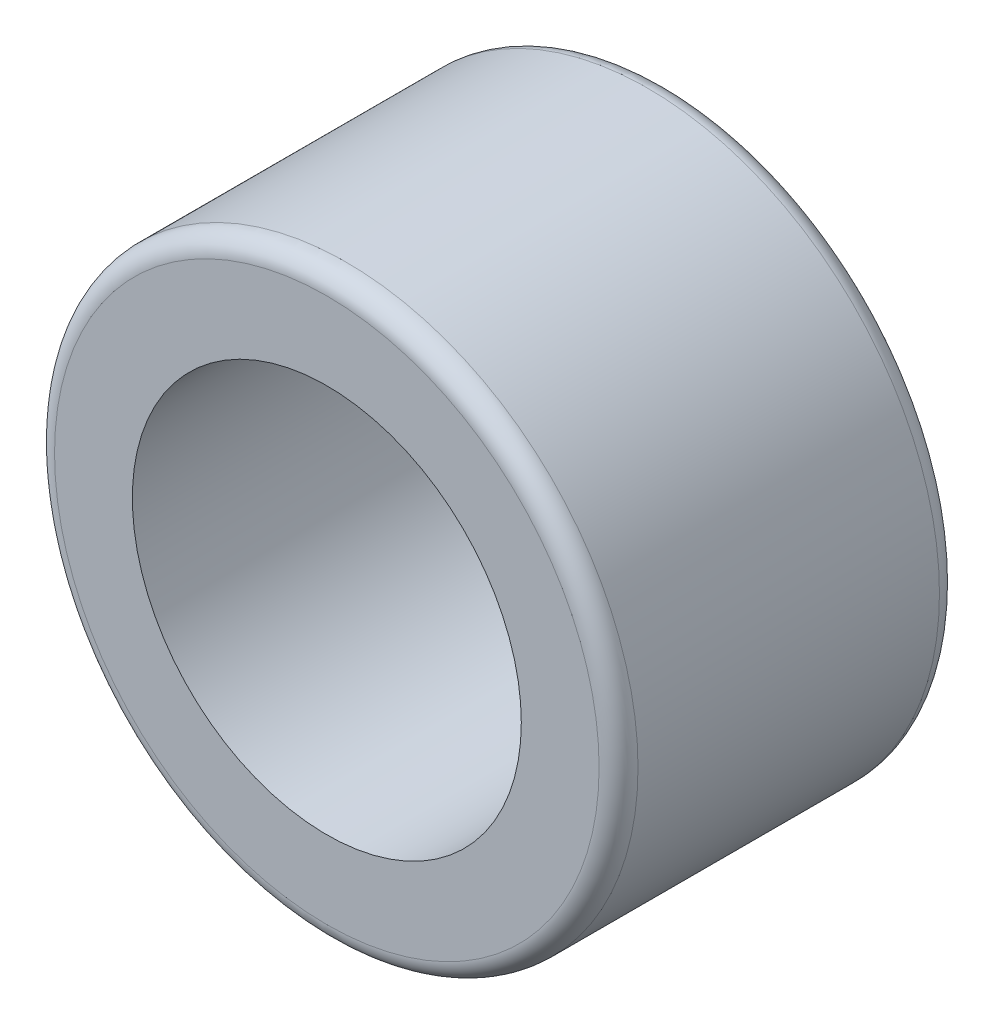
ISO-10303-21;
HEADER;
FILE_DESCRIPTION(('STEP AP214'),'2;1');
FILE_NAME('part.step','',(''),(''),'','','');
FILE_SCHEMA(('AUTOMOTIVE_DESIGN { 1 0 10303 214 1 1 1 1 }'));
ENDSEC;
DATA;
#1=APPLICATION_CONTEXT('core data for automotive mechanical design processes');
#2=APPLICATION_PROTOCOL_DEFINITION('international standard','automotive_design',2000,#1);
#3=PRODUCT_CONTEXT('',#1,'mechanical');
#4=PRODUCT('Part','Part','',(#3));
#5=PRODUCT_RELATED_PRODUCT_CATEGORY('part','',(#4));
#6=PRODUCT_DEFINITION_FORMATION('','',#4);
#7=PRODUCT_DEFINITION_CONTEXT('part definition',#1,'design');
#8=PRODUCT_DEFINITION('design','',#6,#7);
#9=PRODUCT_DEFINITION_SHAPE('','',#8);
#10=(LENGTH_UNIT() NAMED_UNIT(*) SI_UNIT(.MILLI.,.METRE.));
#11=(NAMED_UNIT(*) PLANE_ANGLE_UNIT() SI_UNIT($,.RADIAN.));
#12=(NAMED_UNIT(*) SI_UNIT($,.STERADIAN.) SOLID_ANGLE_UNIT());
#13=UNCERTAINTY_MEASURE_WITH_UNIT(LENGTH_MEASURE(1.E-05),#10,'distance_accuracy_value','');
#14=(GEOMETRIC_REPRESENTATION_CONTEXT(3) GLOBAL_UNCERTAINTY_ASSIGNED_CONTEXT((#13)) GLOBAL_UNIT_ASSIGNED_CONTEXT((#10,
#11,#12)) REPRESENTATION_CONTEXT('',''));
#15=CARTESIAN_POINT('',(0.,0.,0.));
#16=DIRECTION('',(0.,0.,1.));
#17=DIRECTION('',(1.,0.,0.));
#18=AXIS2_PLACEMENT_3D('',#15,#16,#17);
#19=CARTESIAN_POINT('',(0.,0.,-3.5));
#20=DIRECTION('',(0.,0.,1.));
#21=DIRECTION('',(1.,0.,0.));
#22=AXIS2_PLACEMENT_3D('',#19,#20,#21);
#23=CYLINDRICAL_SURFACE('',#22,3.);
#24=CARTESIAN_POINT('',(0.,0.,-3.3));
#25=DIRECTION('',(0.,0.,1.));
#26=DIRECTION('',(1.,0.,0.));
#27=AXIS2_PLACEMENT_3D('',#24,#25,#26);
#28=CIRCLE('',#27,3.);
#29=CARTESIAN_POINT('',(3.,0.,-3.3));
#30=VERTEX_POINT('',#29);
#31=EDGE_CURVE('E43',#30,#30,#28,.T.);
#32=ORIENTED_EDGE('',*,*,#31,.T.);
#33=EDGE_LOOP('',(#32));
#34=FACE_BOUND('',#33,.T.);
#35=CARTESIAN_POINT('',(0.,0.,-0.2));
#36=DIRECTION('',(0.,0.,1.));
#37=DIRECTION('',(1.,0.,0.));
#38=AXIS2_PLACEMENT_3D('',#35,#36,#37);
#39=CIRCLE('',#38,3.);
#40=CARTESIAN_POINT('',(3.,0.,-0.2));
#41=VERTEX_POINT('',#40);
#42=EDGE_CURVE('E47',#41,#41,#39,.F.);
#43=ORIENTED_EDGE('',*,*,#42,.T.);
#44=EDGE_LOOP('',(#43));
#45=FACE_BOUND('',#44,.T.);
#46=ADVANCED_FACE('F32',(#34,#45),#23,.T.);
#47=CARTESIAN_POINT('',(0.,0.,-3.5));
#48=DIRECTION('',(0.,0.,1.));
#49=DIRECTION('',(1.,0.,0.));
#50=AXIS2_PLACEMENT_3D('',#47,#48,#49);
#51=PLANE('',#50);
#52=CARTESIAN_POINT('',(0.,0.,-3.5));
#53=DIRECTION('',(0.,0.,1.));
#54=DIRECTION('',(1.,0.,0.));
#55=AXIS2_PLACEMENT_3D('',#52,#53,#54);
#56=CIRCLE('',#55,2.8);
#57=CARTESIAN_POINT('',(2.8,0.,-3.5));
#58=VERTEX_POINT('',#57);
#59=EDGE_CURVE('E39',#58,#58,#56,.F.);
#60=ORIENTED_EDGE('',*,*,#59,.T.);
#61=EDGE_LOOP('',(#60));
#62=FACE_BOUND('',#61,.T.);
#63=CARTESIAN_POINT('',(0.,0.,-3.5));
#64=DIRECTION('',(0.,0.,1.));
#65=DIRECTION('',(1.,0.,0.));
#66=AXIS2_PLACEMENT_3D('',#63,#64,#65);
#67=CIRCLE('',#66,2.);
#68=CARTESIAN_POINT('',(2.,0.,-3.5));
#69=VERTEX_POINT('',#68);
#70=EDGE_CURVE('E52',#69,#69,#67,.T.);
#71=ORIENTED_EDGE('',*,*,#70,.T.);
#72=EDGE_LOOP('',(#71));
#73=FACE_BOUND('',#72,.T.);
#74=ADVANCED_FACE('F59',(#62,#73),#51,.F.);
#75=CARTESIAN_POINT('',(0.,0.,0.));
#76=DIRECTION('',(0.,0.,1.));
#77=DIRECTION('',(1.,0.,0.));
#78=AXIS2_PLACEMENT_3D('',#75,#76,#77);
#79=PLANE('',#78);
#80=CARTESIAN_POINT('',(0.,0.,0.));
#81=DIRECTION('',(0.,0.,1.));
#82=DIRECTION('',(1.,0.,0.));
#83=AXIS2_PLACEMENT_3D('',#80,#81,#82);
#84=CIRCLE('',#83,2.8);
#85=CARTESIAN_POINT('',(2.8,0.,0.));
#86=VERTEX_POINT('',#85);
#87=EDGE_CURVE('E10',#86,#86,#84,.T.);
#88=ORIENTED_EDGE('',*,*,#87,.T.);
#89=EDGE_LOOP('',(#88));
#90=FACE_BOUND('',#89,.T.);
#91=CARTESIAN_POINT('',(0.,0.,0.));
#92=DIRECTION('',(0.,0.,1.));
#93=DIRECTION('',(1.,0.,0.));
#94=AXIS2_PLACEMENT_3D('',#91,#92,#93);
#95=CIRCLE('',#94,2.);
#96=CARTESIAN_POINT('',(2.,0.,0.));
#97=VERTEX_POINT('',#96);
#98=EDGE_CURVE('E53',#97,#97,#95,.T.);
#99=ORIENTED_EDGE('',*,*,#98,.F.);
#100=EDGE_LOOP('',(#99));
#101=FACE_BOUND('',#100,.T.);
#102=ADVANCED_FACE('F65',(#90,#101),#79,.T.);
#103=CARTESIAN_POINT('',(0.,0.,-3.5));
#104=DIRECTION('',(0.,0.,1.));
#105=DIRECTION('',(1.,0.,0.));
#106=AXIS2_PLACEMENT_3D('',#103,#104,#105);
#107=CYLINDRICAL_SURFACE('',#106,2.);
#108=ORIENTED_EDGE('',*,*,#70,.F.);
#109=EDGE_LOOP('',(#108));
#110=FACE_BOUND('',#109,.T.);
#111=ORIENTED_EDGE('',*,*,#98,.T.);
#112=EDGE_LOOP('',(#111));
#113=FACE_BOUND('',#112,.T.);
#114=ADVANCED_FACE('F61',(#110,#113),#107,.F.);
#115=CARTESIAN_POINT('',(0.,0.,-3.3));
#116=DIRECTION('',(0.,0.,1.));
#117=DIRECTION('',(1.,0.,0.));
#118=AXIS2_PLACEMENT_3D('',#115,#116,#117);
#119=TOROIDAL_SURFACE('',#118,2.8,0.2);
#120=ORIENTED_EDGE('',*,*,#59,.F.);
#121=EDGE_LOOP('',(#120));
#122=FACE_BOUND('',#121,.T.);
#123=ORIENTED_EDGE('',*,*,#31,.F.);
#124=EDGE_LOOP('',(#123));
#125=FACE_BOUND('',#124,.T.);
#126=ADVANCED_FACE('F64',(#122,#125),#119,.T.);
#127=CARTESIAN_POINT('',(0.,0.,-0.2));
#128=DIRECTION('',(0.,0.,1.));
#129=DIRECTION('',(1.,0.,0.));
#130=AXIS2_PLACEMENT_3D('',#127,#128,#129);
#131=TOROIDAL_SURFACE('',#130,2.8,0.2);
#132=ORIENTED_EDGE('',*,*,#42,.F.);
#133=EDGE_LOOP('',(#132));
#134=FACE_BOUND('',#133,.T.);
#135=ORIENTED_EDGE('',*,*,#87,.F.);
#136=EDGE_LOOP('',(#135));
#137=FACE_BOUND('',#136,.T.);
#138=ADVANCED_FACE('F34',(#134,#137),#131,.T.);
#139=CLOSED_SHELL('',(#46,#74,#102,#114,#126,#138));
#140=MANIFOLD_SOLID_BREP('B2',#139);
#141=ADVANCED_BREP_SHAPE_REPRESENTATION('',(#18,#140),#14);
#142=SHAPE_DEFINITION_REPRESENTATION(#9,#141);
ENDSEC;
END-ISO-10303-21;
